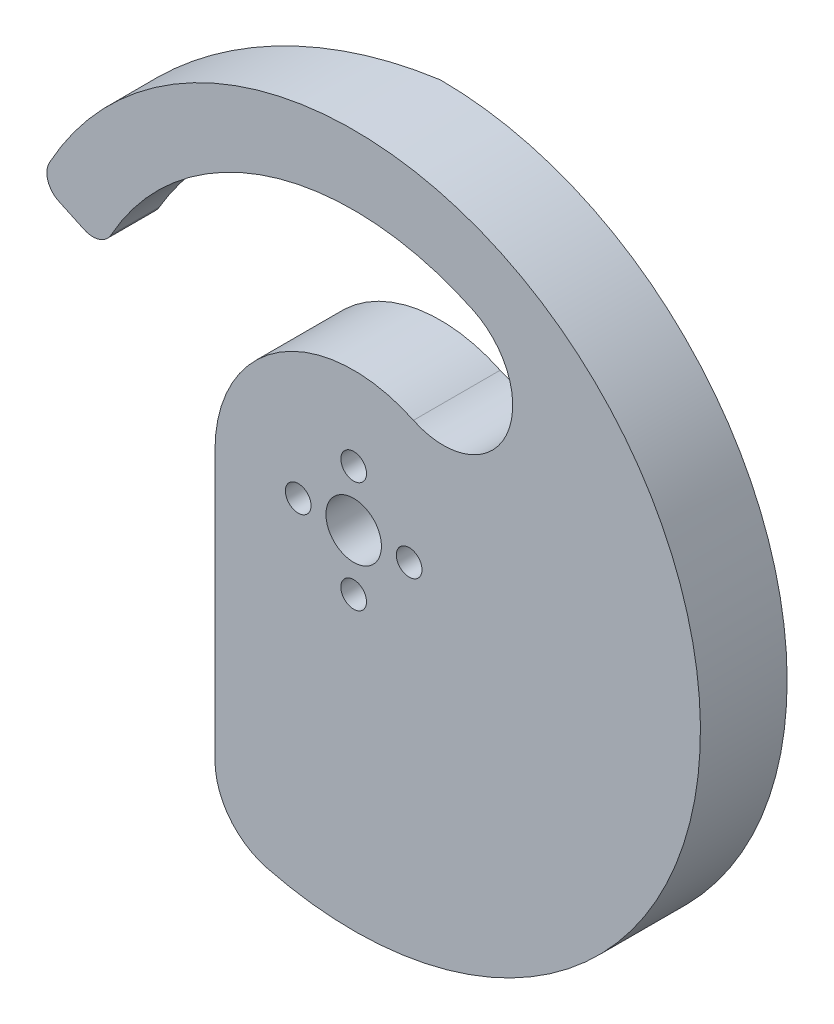
ISO-10303-21;
HEADER;
FILE_DESCRIPTION(('STEP AP214'),'2;1');
FILE_NAME('part.step','',(''),(''),'','','');
FILE_SCHEMA(('AUTOMOTIVE_DESIGN { 1 0 10303 214 1 1 1 1 }'));
ENDSEC;
DATA;
#1=APPLICATION_CONTEXT('core data for automotive mechanical design processes');
#2=APPLICATION_PROTOCOL_DEFINITION('international standard','automotive_design',2000,#1);
#3=PRODUCT_CONTEXT('',#1,'mechanical');
#4=PRODUCT('Part','Part','',(#3));
#5=PRODUCT_RELATED_PRODUCT_CATEGORY('part','',(#4));
#6=PRODUCT_DEFINITION_FORMATION('','',#4);
#7=PRODUCT_DEFINITION_CONTEXT('part definition',#1,'design');
#8=PRODUCT_DEFINITION('design','',#6,#7);
#9=PRODUCT_DEFINITION_SHAPE('','',#8);
#10=(LENGTH_UNIT() NAMED_UNIT(*) SI_UNIT(.MILLI.,.METRE.));
#11=(NAMED_UNIT(*) PLANE_ANGLE_UNIT() SI_UNIT($,.RADIAN.));
#12=(NAMED_UNIT(*) SI_UNIT($,.STERADIAN.) SOLID_ANGLE_UNIT());
#13=UNCERTAINTY_MEASURE_WITH_UNIT(LENGTH_MEASURE(1.E-05),#10,'distance_accuracy_value','');
#14=(GEOMETRIC_REPRESENTATION_CONTEXT(3) GLOBAL_UNCERTAINTY_ASSIGNED_CONTEXT((#13)) GLOBAL_UNIT_ASSIGNED_CONTEXT((#10,
#11,#12)) REPRESENTATION_CONTEXT('',''));
#15=CARTESIAN_POINT('',(0.,0.,0.));
#16=DIRECTION('',(0.,0.,1.));
#17=DIRECTION('',(1.,0.,0.));
#18=AXIS2_PLACEMENT_3D('',#15,#16,#17);
#19=CARTESIAN_POINT('',(0.,0.,12.5));
#20=DIRECTION('',(0.,0.,-1.));
#21=DIRECTION('',(-1.,0.,0.));
#22=AXIS2_PLACEMENT_3D('',#19,#20,#21);
#23=PLANE('',#22);
#24=DIRECTION('',(0.,-1.,0.));
#25=VECTOR('',#24,1.);
#26=CARTESIAN_POINT('',(-20.,0.,12.5));
#27=LINE('',#26,#25);
#28=CARTESIAN_POINT('',(-20.,0.,12.5));
#29=VERTEX_POINT('',#28);
#30=CARTESIAN_POINT('',(-20.,-38.7298334620741,12.5));
#31=VERTEX_POINT('',#30);
#32=EDGE_CURVE('E149',#29,#31,#27,.T.);
#33=ORIENTED_EDGE('',*,*,#32,.T.);
#34=CARTESIAN_POINT('',(-10.,-38.7298334620742,12.5));
#35=DIRECTION('',(0.,0.,-1.));
#36=DIRECTION('',(-1.,0.,0.));
#37=AXIS2_PLACEMENT_3D('',#34,#35,#36);
#38=CIRCLE('',#37,10.);
#39=CARTESIAN_POINT('',(-12.5,-48.4122918275927,12.5));
#40=VERTEX_POINT('',#39);
#41=EDGE_CURVE('E41',#31,#40,#38,.F.);
#42=ORIENTED_EDGE('',*,*,#41,.T.);
#43=CARTESIAN_POINT('',(0.,0.,12.5));
#44=DIRECTION('',(0.,0.,1.));
#45=DIRECTION('',(1.,0.,0.));
#46=AXIS2_PLACEMENT_3D('',#43,#44,#45);
#47=CIRCLE('',#46,50.);
#48=CARTESIAN_POINT('',(-43.8742005217573,23.9802945890293,12.5));
#49=VERTEX_POINT('',#48);
#50=EDGE_CURVE('E148',#40,#49,#47,.T.);
#51=ORIENTED_EDGE('',*,*,#50,.T.);
#52=CARTESIAN_POINT('',(-41.2417484904519,22.5414769136876,12.5));
#53=DIRECTION('',(0.,0.,-1.));
#54=DIRECTION('',(-1.,0.,0.));
#55=AXIS2_PLACEMENT_3D('',#52,#53,#54);
#56=CIRCLE('',#55,3.);
#57=CARTESIAN_POINT('',(-42.509603275674,19.8225535525776,12.5));
#58=VERTEX_POINT('',#57);
#59=EDGE_CURVE('E135',#49,#58,#56,.F.);
#60=ORIENTED_EDGE('',*,*,#59,.T.);
#61=DIRECTION('',(0.90630778703665,-0.4226182617407,0.));
#62=VECTOR('',#61,1.);
#63=CARTESIAN_POINT('',(-45.3153893518325,21.130913087035,12.5));
#64=LINE('',#63,#62);
#65=CARTESIAN_POINT('',(-38.8762729812364,18.1283038116748,12.5));
#66=VERTEX_POINT('',#65);
#67=EDGE_CURVE('E152',#58,#66,#64,.T.);
#68=ORIENTED_EDGE('',*,*,#67,.T.);
#69=CARTESIAN_POINT('',(-37.6084181960143,20.8472271727848,12.5));
#70=DIRECTION('',(0.,0.,-1.));
#71=DIRECTION('',(-1.,0.,0.));
#72=AXIS2_PLACEMENT_3D('',#69,#70,#71);
#73=CIRCLE('',#72,3.);
#74=CARTESIAN_POINT('',(-34.9845750660599,19.3927694630556,12.5));
#75=VERTEX_POINT('',#74);
#76=EDGE_CURVE('E137',#66,#75,#73,.F.);
#77=ORIENTED_EDGE('',*,*,#76,.T.);
#78=CARTESIAN_POINT('',(0.,0.,12.5));
#79=DIRECTION('',(0.,0.,-1.));
#80=DIRECTION('',(1.,0.,0.));
#81=AXIS2_PLACEMENT_3D('',#78,#79,#80);
#82=CIRCLE('',#81,40.);
#83=CARTESIAN_POINT('',(17.2385762508461,36.0947570824873,12.5));
#84=VERTEX_POINT('',#83);
#85=EDGE_CURVE('E176',#75,#84,#82,.T.);
#86=ORIENTED_EDGE('',*,*,#85,.T.);
#87=CARTESIAN_POINT('',(12.9289321881346,27.0710678118654,12.5));
#88=DIRECTION('',(0.,0.,-1.));
#89=DIRECTION('',(-1.,0.,0.));
#90=AXIS2_PLACEMENT_3D('',#87,#88,#89);
#91=CIRCLE('',#90,10.);
#92=CARTESIAN_POINT('',(20.0000000000001,20.,12.5));
#93=VERTEX_POINT('',#92);
#94=EDGE_CURVE('E184',#84,#93,#91,.T.);
#95=ORIENTED_EDGE('',*,*,#94,.T.);
#96=CARTESIAN_POINT('',(12.9289321881346,27.0710678118655,12.5));
#97=DIRECTION('',(0.,0.,-1.));
#98=DIRECTION('',(-1.,0.,0.));
#99=AXIS2_PLACEMENT_3D('',#96,#97,#98);
#100=CIRCLE('',#99,10.);
#101=CARTESIAN_POINT('',(8.61928812542306,18.0473785412436,12.5));
#102=VERTEX_POINT('',#101);
#103=EDGE_CURVE('E188',#93,#102,#100,.T.);
#104=ORIENTED_EDGE('',*,*,#103,.T.);
#105=CARTESIAN_POINT('',(0.,0.,12.5));
#106=DIRECTION('',(0.,0.,1.));
#107=DIRECTION('',(-1.,0.,0.));
#108=AXIS2_PLACEMENT_3D('',#105,#106,#107);
#109=CIRCLE('',#108,20.);
#110=EDGE_CURVE('E173',#102,#29,#109,.T.);
#111=ORIENTED_EDGE('',*,*,#110,.T.);
#112=EDGE_LOOP('',(#33,#42,#51,#60,#68,#77,#86,#95,#104,#111));
#113=FACE_BOUND('',#112,.T.);
#114=CARTESIAN_POINT('',(0.,0.,12.5));
#115=DIRECTION('',(0.,0.,1.));
#116=DIRECTION('',(1.,0.,0.));
#117=AXIS2_PLACEMENT_3D('',#114,#115,#116);
#118=CIRCLE('',#117,4.);
#119=CARTESIAN_POINT('',(4.,0.,12.5));
#120=VERTEX_POINT('',#119);
#121=EDGE_CURVE('E168',#120,#120,#118,.T.);
#122=ORIENTED_EDGE('',*,*,#121,.F.);
#123=EDGE_LOOP('',(#122));
#124=FACE_BOUND('',#123,.T.);
#125=CARTESIAN_POINT('',(0.,8.,12.5));
#126=DIRECTION('',(0.,0.,1.));
#127=DIRECTION('',(1.,0.,0.));
#128=AXIS2_PLACEMENT_3D('',#125,#126,#127);
#129=CIRCLE('',#128,1.85);
#130=CARTESIAN_POINT('',(1.85,8.,12.5));
#131=VERTEX_POINT('',#130);
#132=EDGE_CURVE('E214',#131,#131,#129,.T.);
#133=ORIENTED_EDGE('',*,*,#132,.F.);
#134=EDGE_LOOP('',(#133));
#135=FACE_BOUND('',#134,.T.);
#136=CARTESIAN_POINT('',(8.,0.,12.5));
#137=DIRECTION('',(0.,0.,1.));
#138=DIRECTION('',(1.,0.,0.));
#139=AXIS2_PLACEMENT_3D('',#136,#137,#138);
#140=CIRCLE('',#139,1.85);
#141=CARTESIAN_POINT('',(9.85,0.,12.5));
#142=VERTEX_POINT('',#141);
#143=EDGE_CURVE('E220',#142,#142,#140,.T.);
#144=ORIENTED_EDGE('',*,*,#143,.F.);
#145=EDGE_LOOP('',(#144));
#146=FACE_BOUND('',#145,.T.);
#147=CARTESIAN_POINT('',(0.,-8.,12.5));
#148=DIRECTION('',(0.,0.,1.));
#149=DIRECTION('',(1.,0.,0.));
#150=AXIS2_PLACEMENT_3D('',#147,#148,#149);
#151=CIRCLE('',#150,1.85);
#152=CARTESIAN_POINT('',(1.84999999999994,-8.,12.5));
#153=VERTEX_POINT('',#152);
#154=EDGE_CURVE('E226',#153,#153,#151,.T.);
#155=ORIENTED_EDGE('',*,*,#154,.F.);
#156=EDGE_LOOP('',(#155));
#157=FACE_BOUND('',#156,.T.);
#158=CARTESIAN_POINT('',(-8.,0.,12.5));
#159=DIRECTION('',(0.,0.,1.));
#160=DIRECTION('',(1.,0.,0.));
#161=AXIS2_PLACEMENT_3D('',#158,#159,#160);
#162=CIRCLE('',#161,1.85);
#163=CARTESIAN_POINT('',(-6.15,0.,12.5));
#164=VERTEX_POINT('',#163);
#165=EDGE_CURVE('E232',#164,#164,#162,.T.);
#166=ORIENTED_EDGE('',*,*,#165,.F.);
#167=EDGE_LOOP('',(#166));
#168=FACE_BOUND('',#167,.T.);
#169=ADVANCED_FACE('F33',(#113,#124,#135,#146,#157,#168),#23,.F.);
#170=CARTESIAN_POINT('',(0.,0.,0.));
#171=DIRECTION('',(0.,0.,-1.));
#172=DIRECTION('',(-1.,0.,0.));
#173=AXIS2_PLACEMENT_3D('',#170,#171,#172);
#174=PLANE('',#173);
#175=DIRECTION('',(0.,-1.,0.));
#176=VECTOR('',#175,1.);
#177=CARTESIAN_POINT('',(0.,0.,0.));
#178=LINE('',#177,#176);
#179=CARTESIAN_POINT('',(0.,50.,0.));
#180=VERTEX_POINT('',#179);
#181=CARTESIAN_POINT('',(0.,40.,0.));
#182=VERTEX_POINT('',#181);
#183=EDGE_CURVE('E131',#180,#182,#178,.T.);
#184=ORIENTED_EDGE('',*,*,#183,.F.);
#185=CARTESIAN_POINT('',(0.,0.,0.));
#186=DIRECTION('',(0.,0.,1.));
#187=DIRECTION('',(1.,0.,0.));
#188=AXIS2_PLACEMENT_3D('',#185,#186,#187);
#189=CIRCLE('',#188,50.);
#190=CARTESIAN_POINT('',(-12.5,-48.4122918275927,0.));
#191=VERTEX_POINT('',#190);
#192=EDGE_CURVE('E130',#191,#180,#189,.T.);
#193=ORIENTED_EDGE('',*,*,#192,.F.);
#194=CARTESIAN_POINT('',(-10.,-38.7298334620742,0.));
#195=DIRECTION('',(0.,0.,-1.));
#196=DIRECTION('',(-1.,0.,0.));
#197=AXIS2_PLACEMENT_3D('',#194,#195,#196);
#198=CIRCLE('',#197,10.);
#199=CARTESIAN_POINT('',(-20.,-38.7298334620741,0.));
#200=VERTEX_POINT('',#199);
#201=EDGE_CURVE('E139',#191,#200,#198,.T.);
#202=ORIENTED_EDGE('',*,*,#201,.T.);
#203=DIRECTION('',(0.,-1.,0.));
#204=VECTOR('',#203,1.);
#205=CARTESIAN_POINT('',(-20.,0.,0.));
#206=LINE('',#205,#204);
#207=CARTESIAN_POINT('',(-20.,0.,0.));
#208=VERTEX_POINT('',#207);
#209=EDGE_CURVE('E159',#208,#200,#206,.T.);
#210=ORIENTED_EDGE('',*,*,#209,.F.);
#211=CARTESIAN_POINT('',(0.,0.,0.));
#212=DIRECTION('',(0.,0.,1.));
#213=DIRECTION('',(-1.,0.,0.));
#214=AXIS2_PLACEMENT_3D('',#211,#212,#213);
#215=CIRCLE('',#214,20.);
#216=CARTESIAN_POINT('',(8.61928812542306,18.0473785412436,0.));
#217=VERTEX_POINT('',#216);
#218=EDGE_CURVE('E164',#217,#208,#215,.T.);
#219=ORIENTED_EDGE('',*,*,#218,.F.);
#220=CARTESIAN_POINT('',(12.9289321881346,27.0710678118655,0.));
#221=DIRECTION('',(0.,0.,-1.));
#222=DIRECTION('',(-1.,0.,0.));
#223=AXIS2_PLACEMENT_3D('',#220,#221,#222);
#224=CIRCLE('',#223,10.);
#225=CARTESIAN_POINT('',(20.0000000000001,20.,0.));
#226=VERTEX_POINT('',#225);
#227=EDGE_CURVE('E186',#217,#226,#224,.F.);
#228=ORIENTED_EDGE('',*,*,#227,.T.);
#229=CARTESIAN_POINT('',(12.9289321881346,27.0710678118654,0.));
#230=DIRECTION('',(0.,0.,-1.));
#231=DIRECTION('',(-1.,0.,0.));
#232=AXIS2_PLACEMENT_3D('',#229,#230,#231);
#233=CIRCLE('',#232,10.);
#234=CARTESIAN_POINT('',(17.2385762508461,36.0947570824873,0.));
#235=VERTEX_POINT('',#234);
#236=EDGE_CURVE('E181',#226,#235,#233,.F.);
#237=ORIENTED_EDGE('',*,*,#236,.T.);
#238=CARTESIAN_POINT('',(0.,0.,0.));
#239=DIRECTION('',(0.,0.,-1.));
#240=DIRECTION('',(1.,0.,0.));
#241=AXIS2_PLACEMENT_3D('',#238,#239,#240);
#242=CIRCLE('',#241,40.);
#243=EDGE_CURVE('E166',#182,#235,#242,.T.);
#244=ORIENTED_EDGE('',*,*,#243,.F.);
#245=EDGE_LOOP('',(#184,#193,#202,#210,#219,#228,#237,#244));
#246=FACE_BOUND('',#245,.T.);
#247=CARTESIAN_POINT('',(0.,-8.,0.));
#248=DIRECTION('',(0.,0.,1.));
#249=DIRECTION('',(1.,0.,0.));
#250=AXIS2_PLACEMENT_3D('',#247,#248,#249);
#251=CIRCLE('',#250,1.85);
#252=CARTESIAN_POINT('',(1.84999999999994,-8.,0.));
#253=VERTEX_POINT('',#252);
#254=EDGE_CURVE('E229',#253,#253,#251,.T.);
#255=ORIENTED_EDGE('',*,*,#254,.T.);
#256=EDGE_LOOP('',(#255));
#257=FACE_BOUND('',#256,.T.);
#258=CARTESIAN_POINT('',(0.,8.,0.));
#259=DIRECTION('',(0.,0.,1.));
#260=DIRECTION('',(1.,0.,0.));
#261=AXIS2_PLACEMENT_3D('',#258,#259,#260);
#262=CIRCLE('',#261,1.85);
#263=CARTESIAN_POINT('',(1.85,8.,0.));
#264=VERTEX_POINT('',#263);
#265=EDGE_CURVE('E217',#264,#264,#262,.T.);
#266=ORIENTED_EDGE('',*,*,#265,.T.);
#267=EDGE_LOOP('',(#266));
#268=FACE_BOUND('',#267,.T.);
#269=CARTESIAN_POINT('',(0.,0.,0.));
#270=DIRECTION('',(0.,0.,1.));
#271=DIRECTION('',(1.,0.,0.));
#272=AXIS2_PLACEMENT_3D('',#269,#270,#271);
#273=CIRCLE('',#272,4.);
#274=CARTESIAN_POINT('',(4.,0.,0.));
#275=VERTEX_POINT('',#274);
#276=EDGE_CURVE('E211',#275,#275,#273,.T.);
#277=ORIENTED_EDGE('',*,*,#276,.T.);
#278=EDGE_LOOP('',(#277));
#279=FACE_BOUND('',#278,.T.);
#280=CARTESIAN_POINT('',(8.,0.,0.));
#281=DIRECTION('',(0.,0.,1.));
#282=DIRECTION('',(1.,0.,0.));
#283=AXIS2_PLACEMENT_3D('',#280,#281,#282);
#284=CIRCLE('',#283,1.85);
#285=CARTESIAN_POINT('',(9.85,0.,0.));
#286=VERTEX_POINT('',#285);
#287=EDGE_CURVE('E223',#286,#286,#284,.T.);
#288=ORIENTED_EDGE('',*,*,#287,.T.);
#289=EDGE_LOOP('',(#288));
#290=FACE_BOUND('',#289,.T.);
#291=CARTESIAN_POINT('',(-8.,0.,0.));
#292=DIRECTION('',(0.,0.,1.));
#293=DIRECTION('',(1.,0.,0.));
#294=AXIS2_PLACEMENT_3D('',#291,#292,#293);
#295=CIRCLE('',#294,1.85);
#296=CARTESIAN_POINT('',(-6.15,0.,0.));
#297=VERTEX_POINT('',#296);
#298=EDGE_CURVE('E194',#297,#297,#295,.T.);
#299=ORIENTED_EDGE('',*,*,#298,.T.);
#300=EDGE_LOOP('',(#299));
#301=FACE_BOUND('',#300,.T.);
#302=ADVANCED_FACE('F156',(#246,#257,#268,#279,#290,#301),#174,.T.);
#303=CARTESIAN_POINT('',(0.,0.,12.5));
#304=DIRECTION('',(0.,0.,-1.));
#305=DIRECTION('',(-1.,0.,0.));
#306=AXIS2_PLACEMENT_3D('',#303,#304,#305);
#307=CYLINDRICAL_SURFACE('',#306,20.);
#308=ORIENTED_EDGE('',*,*,#110,.F.);
#309=DIRECTION('',(0.,0.,-1.));
#310=VECTOR('',#309,1.);
#311=CARTESIAN_POINT('',(8.61928812542306,18.0473785412436,12.5));
#312=LINE('',#311,#310);
#313=EDGE_CURVE('E179',#102,#217,#312,.T.);
#314=ORIENTED_EDGE('',*,*,#313,.T.);
#315=ORIENTED_EDGE('',*,*,#218,.T.);
#316=DIRECTION('',(0.,0.,-1.));
#317=VECTOR('',#316,1.);
#318=CARTESIAN_POINT('',(-20.,0.,12.5));
#319=LINE('',#318,#317);
#320=EDGE_CURVE('E163',#29,#208,#319,.T.);
#321=ORIENTED_EDGE('',*,*,#320,.F.);
#322=EDGE_LOOP('',(#308,#314,#315,#321));
#323=FACE_BOUND('',#322,.T.);
#324=ADVANCED_FACE('F265',(#323),#307,.T.);
#325=CARTESIAN_POINT('',(-20.,0.,12.5));
#326=DIRECTION('',(1.,0.,0.));
#327=DIRECTION('',(0.,0.,-1.));
#328=AXIS2_PLACEMENT_3D('',#325,#326,#327);
#329=PLANE('',#328);
#330=ORIENTED_EDGE('',*,*,#209,.T.);
#331=DIRECTION('',(0.,0.,-1.));
#332=VECTOR('',#331,1.);
#333=CARTESIAN_POINT('',(-20.,-38.7298334620742,12.5));
#334=LINE('',#333,#332);
#335=EDGE_CURVE('E55',#200,#31,#334,.F.);
#336=ORIENTED_EDGE('',*,*,#335,.T.);
#337=ORIENTED_EDGE('',*,*,#32,.F.);
#338=ORIENTED_EDGE('',*,*,#320,.T.);
#339=EDGE_LOOP('',(#330,#336,#337,#338));
#340=FACE_BOUND('',#339,.T.);
#341=ADVANCED_FACE('F161',(#340),#329,.F.);
#342=CARTESIAN_POINT('',(0.,0.,12.5));
#343=DIRECTION('',(0.,0.,-1.));
#344=DIRECTION('',(-1.,0.,0.));
#345=AXIS2_PLACEMENT_3D('',#342,#343,#344);
#346=CYLINDRICAL_SURFACE('',#345,50.);
#347=ORIENTED_EDGE('',*,*,#192,.T.);
#348=CARTESIAN_POINT('',(0.,0.,0.));
#349=DIRECTION('',(0.156434465040224,0.,0.987688340595139));
#350=DIRECTION('',(0.987688340595139,0.,-0.156434465040224));
#351=AXIS2_PLACEMENT_3D('',#348,#349,#350);
#352=ELLIPSE('',#351,50.6232562894001,50.);
#353=CARTESIAN_POINT('',(-43.8742005217573,23.9802945890293,6.94899069432472));
#354=VERTEX_POINT('',#353);
#355=EDGE_CURVE('E116',#180,#354,#352,.T.);
#356=ORIENTED_EDGE('',*,*,#355,.T.);
#357=DIRECTION('',(0.,0.,-1.));
#358=VECTOR('',#357,1.);
#359=CARTESIAN_POINT('',(-43.8742005217573,23.9802945890293,12.5));
#360=LINE('',#359,#358);
#361=EDGE_CURVE('E126',#354,#49,#360,.F.);
#362=ORIENTED_EDGE('',*,*,#361,.T.);
#363=ORIENTED_EDGE('',*,*,#50,.F.);
#364=DIRECTION('',(0.,0.,-1.));
#365=VECTOR('',#364,1.);
#366=CARTESIAN_POINT('',(-12.5,-48.4122918275927,12.5));
#367=LINE('',#366,#365);
#368=EDGE_CURVE('E136',#40,#191,#367,.T.);
#369=ORIENTED_EDGE('',*,*,#368,.T.);
#370=EDGE_LOOP('',(#347,#356,#362,#363,#369));
#371=FACE_BOUND('',#370,.T.);
#372=ADVANCED_FACE('F124',(#371),#346,.T.);
#373=CARTESIAN_POINT('',(-45.3153893518325,21.130913087035,12.5));
#374=DIRECTION('',(0.4226182617407,0.90630778703665,0.));
#375=DIRECTION('',(-0.90630778703665,0.4226182617407,0.));
#376=AXIS2_PLACEMENT_3D('',#373,#374,#375);
#377=PLANE('',#376);
#378=DIRECTION('',(0.,0.,-1.));
#379=VECTOR('',#378,1.);
#380=CARTESIAN_POINT('',(-42.509603275674,19.8225535525776,12.5));
#381=LINE('',#380,#379);
#382=CARTESIAN_POINT('',(-42.509603275674,19.8225535525776,6.73285972323542));
#383=VERTEX_POINT('',#382);
#384=EDGE_CURVE('E198',#58,#383,#381,.T.);
#385=ORIENTED_EDGE('',*,*,#384,.T.);
#386=DIRECTION('',(0.897112332638574,-0.418330350934662,-0.142088634713194));
#387=VECTOR('',#386,1.);
#388=CARTESIAN_POINT('',(-45.9938771258547,21.4472971320261,7.28471448693368));
#389=LINE('',#388,#387);
#390=CARTESIAN_POINT('',(-38.8762729812364,18.1283038116748,6.15739673803677));
#391=VERTEX_POINT('',#390);
#392=EDGE_CURVE('E47',#383,#391,#389,.T.);
#393=ORIENTED_EDGE('',*,*,#392,.T.);
#394=DIRECTION('',(0.,0.,-1.));
#395=VECTOR('',#394,1.);
#396=CARTESIAN_POINT('',(-38.8762729812364,18.1283038116748,12.5));
#397=LINE('',#396,#395);
#398=EDGE_CURVE('E200',#391,#66,#397,.F.);
#399=ORIENTED_EDGE('',*,*,#398,.T.);
#400=ORIENTED_EDGE('',*,*,#67,.F.);
#401=EDGE_LOOP('',(#385,#393,#399,#400));
#402=FACE_BOUND('',#401,.T.);
#403=ADVANCED_FACE('F205',(#402),#377,.F.);
#404=CARTESIAN_POINT('',(0.,0.,12.5));
#405=DIRECTION('',(0.,0.,-1.));
#406=DIRECTION('',(-1.,0.,0.));
#407=AXIS2_PLACEMENT_3D('',#404,#405,#406);
#408=CYLINDRICAL_SURFACE('',#407,40.);
#409=DIRECTION('',(0.,0.,-1.));
#410=VECTOR('',#409,1.);
#411=CARTESIAN_POINT('',(-34.9845750660599,19.3927694630556,12.5));
#412=LINE('',#411,#410);
#413=CARTESIAN_POINT('',(-34.9845750660599,19.3927694630556,5.54101234182938));
#414=VERTEX_POINT('',#413);
#415=EDGE_CURVE('E190',#75,#414,#412,.T.);
#416=ORIENTED_EDGE('',*,*,#415,.T.);
#417=CARTESIAN_POINT('',(0.,0.,0.));
#418=DIRECTION('',(0.156434465040224,0.,0.987688340595139));
#419=DIRECTION('',(0.987688340595139,0.,-0.156434465040224));
#420=AXIS2_PLACEMENT_3D('',#417,#418,#419);
#421=ELLIPSE('',#420,40.4986050315201,40.);
#422=EDGE_CURVE('E195',#414,#182,#421,.F.);
#423=ORIENTED_EDGE('',*,*,#422,.T.);
#424=ORIENTED_EDGE('',*,*,#243,.T.);
#425=DIRECTION('',(0.,0.,-1.));
#426=VECTOR('',#425,1.);
#427=CARTESIAN_POINT('',(17.2385762508461,36.0947570824873,12.5));
#428=LINE('',#427,#426);
#429=EDGE_CURVE('E175',#235,#84,#428,.F.);
#430=ORIENTED_EDGE('',*,*,#429,.T.);
#431=ORIENTED_EDGE('',*,*,#85,.F.);
#432=EDGE_LOOP('',(#416,#423,#424,#430,#431));
#433=FACE_BOUND('',#432,.T.);
#434=ADVANCED_FACE('F251',(#433),#408,.F.);
#435=CARTESIAN_POINT('',(0.,0.,12.5));
#436=DIRECTION('',(0.,0.,-1.));
#437=DIRECTION('',(-1.,0.,0.));
#438=AXIS2_PLACEMENT_3D('',#435,#436,#437);
#439=CYLINDRICAL_SURFACE('',#438,4.);
#440=ORIENTED_EDGE('',*,*,#121,.T.);
#441=EDGE_LOOP('',(#440));
#442=FACE_BOUND('',#441,.T.);
#443=ORIENTED_EDGE('',*,*,#276,.F.);
#444=EDGE_LOOP('',(#443));
#445=FACE_BOUND('',#444,.T.);
#446=ADVANCED_FACE('F281',(#442,#445),#439,.F.);
#447=CARTESIAN_POINT('',(0.,8.,12.5));
#448=DIRECTION('',(0.,0.,-1.));
#449=DIRECTION('',(-1.,0.,0.));
#450=AXIS2_PLACEMENT_3D('',#447,#448,#449);
#451=CYLINDRICAL_SURFACE('',#450,1.85);
#452=ORIENTED_EDGE('',*,*,#132,.T.);
#453=EDGE_LOOP('',(#452));
#454=FACE_BOUND('',#453,.T.);
#455=ORIENTED_EDGE('',*,*,#265,.F.);
#456=EDGE_LOOP('',(#455));
#457=FACE_BOUND('',#456,.T.);
#458=ADVANCED_FACE('F385',(#454,#457),#451,.F.);
#459=CARTESIAN_POINT('',(8.,0.,12.5));
#460=DIRECTION('',(0.,0.,-1.));
#461=DIRECTION('',(-1.,0.,0.));
#462=AXIS2_PLACEMENT_3D('',#459,#460,#461);
#463=CYLINDRICAL_SURFACE('',#462,1.85);
#464=ORIENTED_EDGE('',*,*,#143,.T.);
#465=EDGE_LOOP('',(#464));
#466=FACE_BOUND('',#465,.T.);
#467=ORIENTED_EDGE('',*,*,#287,.F.);
#468=EDGE_LOOP('',(#467));
#469=FACE_BOUND('',#468,.T.);
#470=ADVANCED_FACE('F375',(#466,#469),#463,.F.);
#471=CARTESIAN_POINT('',(0.,-8.,12.5));
#472=DIRECTION('',(0.,0.,-1.));
#473=DIRECTION('',(-1.,0.,0.));
#474=AXIS2_PLACEMENT_3D('',#471,#472,#473);
#475=CYLINDRICAL_SURFACE('',#474,1.85);
#476=ORIENTED_EDGE('',*,*,#154,.T.);
#477=EDGE_LOOP('',(#476));
#478=FACE_BOUND('',#477,.T.);
#479=ORIENTED_EDGE('',*,*,#254,.F.);
#480=EDGE_LOOP('',(#479));
#481=FACE_BOUND('',#480,.T.);
#482=ADVANCED_FACE('F365',(#478,#481),#475,.F.);
#483=CARTESIAN_POINT('',(-8.,0.,12.5));
#484=DIRECTION('',(0.,0.,-1.));
#485=DIRECTION('',(-1.,0.,0.));
#486=AXIS2_PLACEMENT_3D('',#483,#484,#485);
#487=CYLINDRICAL_SURFACE('',#486,1.85);
#488=ORIENTED_EDGE('',*,*,#165,.T.);
#489=EDGE_LOOP('',(#488));
#490=FACE_BOUND('',#489,.T.);
#491=ORIENTED_EDGE('',*,*,#298,.F.);
#492=EDGE_LOOP('',(#491));
#493=FACE_BOUND('',#492,.T.);
#494=ADVANCED_FACE('F352',(#490,#493),#487,.F.);
#495=CARTESIAN_POINT('',(12.9289321881346,27.0710678118655,12.5));
#496=DIRECTION('',(0.,0.,-1.));
#497=DIRECTION('',(-1.,0.,0.));
#498=AXIS2_PLACEMENT_3D('',#495,#496,#497);
#499=CYLINDRICAL_SURFACE('',#498,10.);
#500=ORIENTED_EDGE('',*,*,#313,.F.);
#501=ORIENTED_EDGE('',*,*,#103,.F.);
#502=DIRECTION('',(0.,0.,1.));
#503=VECTOR('',#502,1.);
#504=CARTESIAN_POINT('',(20.0000000000001,20.,12.5));
#505=LINE('',#504,#503);
#506=EDGE_CURVE('E191',#226,#93,#505,.T.);
#507=ORIENTED_EDGE('',*,*,#506,.F.);
#508=ORIENTED_EDGE('',*,*,#227,.F.);
#509=EDGE_LOOP('',(#500,#501,#507,#508));
#510=FACE_BOUND('',#509,.T.);
#511=ADVANCED_FACE('F262',(#510),#499,.F.);
#512=CARTESIAN_POINT('',(12.9289321881346,27.0710678118654,12.5));
#513=DIRECTION('',(0.,0.,-1.));
#514=DIRECTION('',(-1.,0.,0.));
#515=AXIS2_PLACEMENT_3D('',#512,#513,#514);
#516=CYLINDRICAL_SURFACE('',#515,10.);
#517=ORIENTED_EDGE('',*,*,#94,.F.);
#518=ORIENTED_EDGE('',*,*,#429,.F.);
#519=ORIENTED_EDGE('',*,*,#236,.F.);
#520=ORIENTED_EDGE('',*,*,#506,.T.);
#521=EDGE_LOOP('',(#517,#518,#519,#520));
#522=FACE_BOUND('',#521,.T.);
#523=ADVANCED_FACE('F256',(#522),#516,.F.);
#524=CARTESIAN_POINT('',(-37.6084181960143,20.8472271727848,12.5));
#525=DIRECTION('',(0.,0.,-1.));
#526=DIRECTION('',(-1.,0.,0.));
#527=AXIS2_PLACEMENT_3D('',#524,#525,#526);
#528=CYLINDRICAL_SURFACE('',#527,3.);
#529=CARTESIAN_POINT('',(-37.6084181960143,20.8472271727848,5.95658826746659));
#530=DIRECTION('',(0.156434465040224,0.,0.987688340595139));
#531=DIRECTION('',(0.987688340595139,0.,-0.156434465040224));
#532=AXIS2_PLACEMENT_3D('',#529,#530,#531);
#533=ELLIPSE('',#532,3.03739537736401,3.);
#534=EDGE_CURVE('E241',#414,#391,#533,.F.);
#535=ORIENTED_EDGE('',*,*,#534,.F.);
#536=ORIENTED_EDGE('',*,*,#415,.F.);
#537=ORIENTED_EDGE('',*,*,#76,.F.);
#538=ORIENTED_EDGE('',*,*,#398,.F.);
#539=EDGE_LOOP('',(#535,#536,#537,#538));
#540=FACE_BOUND('',#539,.T.);
#541=ADVANCED_FACE('F246',(#540),#528,.T.);
#542=CARTESIAN_POINT('',(-41.2417484904519,22.5414769136876,12.5));
#543=DIRECTION('',(0.,0.,-1.));
#544=DIRECTION('',(-1.,0.,0.));
#545=AXIS2_PLACEMENT_3D('',#542,#543,#544);
#546=CYLINDRICAL_SURFACE('',#545,3.);
#547=CARTESIAN_POINT('',(-41.2417484904519,22.5414769136876,6.53205125266524));
#548=DIRECTION('',(0.156434465040224,0.,0.987688340595139));
#549=DIRECTION('',(0.987688340595139,0.,-0.156434465040224));
#550=AXIS2_PLACEMENT_3D('',#547,#548,#549);
#551=ELLIPSE('',#550,3.03739537736401,3.);
#552=EDGE_CURVE('E11',#383,#354,#551,.F.);
#553=ORIENTED_EDGE('',*,*,#552,.F.);
#554=ORIENTED_EDGE('',*,*,#384,.F.);
#555=ORIENTED_EDGE('',*,*,#59,.F.);
#556=ORIENTED_EDGE('',*,*,#361,.F.);
#557=EDGE_LOOP('',(#553,#554,#555,#556));
#558=FACE_BOUND('',#557,.T.);
#559=ADVANCED_FACE('F134',(#558),#546,.T.);
#560=CARTESIAN_POINT('',(-10.,-38.7298334620742,12.5));
#561=DIRECTION('',(0.,0.,-1.));
#562=DIRECTION('',(-1.,0.,0.));
#563=AXIS2_PLACEMENT_3D('',#560,#561,#562);
#564=CYLINDRICAL_SURFACE('',#563,10.);
#565=ORIENTED_EDGE('',*,*,#41,.F.);
#566=ORIENTED_EDGE('',*,*,#335,.F.);
#567=ORIENTED_EDGE('',*,*,#201,.F.);
#568=ORIENTED_EDGE('',*,*,#368,.F.);
#569=EDGE_LOOP('',(#565,#566,#567,#568));
#570=FACE_BOUND('',#569,.T.);
#571=ADVANCED_FACE('F35',(#570),#564,.T.);
#572=CARTESIAN_POINT('',(0.,0.,0.));
#573=DIRECTION('',(0.156434465040224,0.,0.987688340595139));
#574=DIRECTION('',(0.987688340595139,0.,-0.156434465040224));
#575=AXIS2_PLACEMENT_3D('',#572,#573,#574);
#576=PLANE('',#575);
#577=ORIENTED_EDGE('',*,*,#534,.T.);
#578=ORIENTED_EDGE('',*,*,#392,.F.);
#579=ORIENTED_EDGE('',*,*,#552,.T.);
#580=ORIENTED_EDGE('',*,*,#355,.F.);
#581=ORIENTED_EDGE('',*,*,#183,.T.);
#582=ORIENTED_EDGE('',*,*,#422,.F.);
#583=EDGE_LOOP('',(#577,#578,#579,#580,#581,#582));
#584=FACE_BOUND('',#583,.T.);
#585=ADVANCED_FACE('F115',(#584),#576,.F.);
#586=CLOSED_SHELL('',(#169,#302,#324,#341,#372,#403,#434,#446,#458,#470,#482,#494,#511,#523,
#541,#559,#571,#585));
#587=MANIFOLD_SOLID_BREP('B2',#586);
#588=ADVANCED_BREP_SHAPE_REPRESENTATION('',(#18,#587),#14);
#589=SHAPE_DEFINITION_REPRESENTATION(#9,#588);
ENDSEC;
END-ISO-10303-21;
